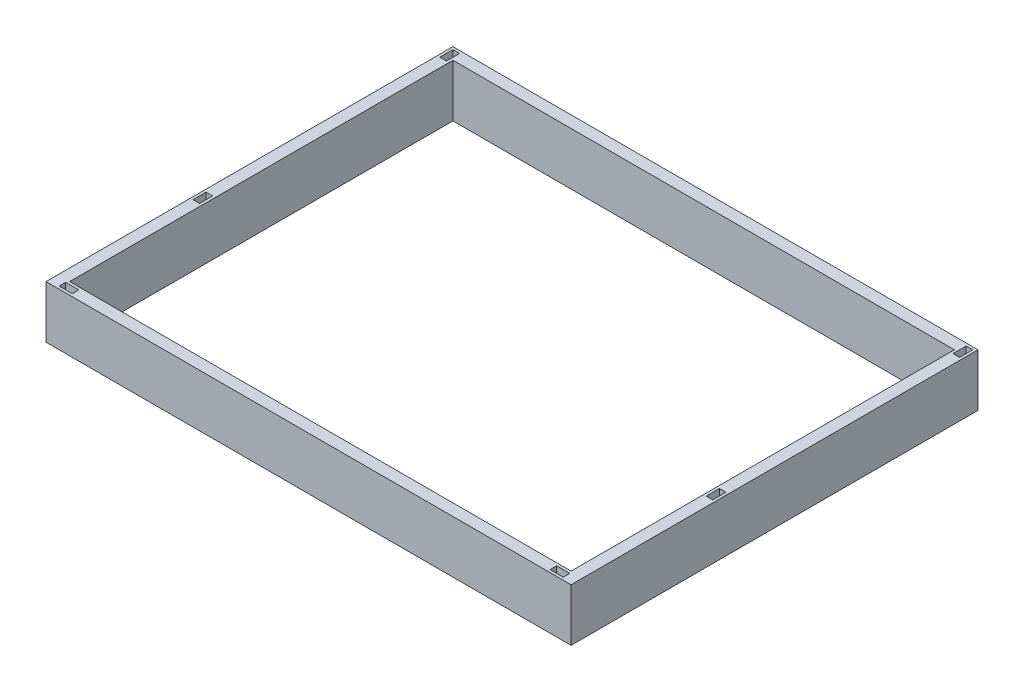
ISO-10303-21;
HEADER;
FILE_DESCRIPTION(('STEP AP214'),'2;1');
FILE_NAME('part.step','',(''),(''),'','','');
FILE_SCHEMA(('AUTOMOTIVE_DESIGN { 1 0 10303 214 1 1 1 1 }'));
ENDSEC;
DATA;
#1=APPLICATION_CONTEXT('core data for automotive mechanical design processes');
#2=APPLICATION_PROTOCOL_DEFINITION('international standard','automotive_design',2000,#1);
#3=PRODUCT_CONTEXT('',#1,'mechanical');
#4=PRODUCT('Part','Part','',(#3));
#5=PRODUCT_RELATED_PRODUCT_CATEGORY('part','',(#4));
#6=PRODUCT_DEFINITION_FORMATION('','',#4);
#7=PRODUCT_DEFINITION_CONTEXT('part definition',#1,'design');
#8=PRODUCT_DEFINITION('design','',#6,#7);
#9=PRODUCT_DEFINITION_SHAPE('','',#8);
#10=(LENGTH_UNIT() NAMED_UNIT(*) SI_UNIT(.MILLI.,.METRE.));
#11=(NAMED_UNIT(*) PLANE_ANGLE_UNIT() SI_UNIT($,.RADIAN.));
#12=(NAMED_UNIT(*) SI_UNIT($,.STERADIAN.) SOLID_ANGLE_UNIT());
#13=UNCERTAINTY_MEASURE_WITH_UNIT(LENGTH_MEASURE(1.E-05),#10,'distance_accuracy_value','');
#14=(GEOMETRIC_REPRESENTATION_CONTEXT(3) GLOBAL_UNCERTAINTY_ASSIGNED_CONTEXT((#13)) GLOBAL_UNIT_ASSIGNED_CONTEXT((#10,
#11,#12)) REPRESENTATION_CONTEXT('',''));
#15=CARTESIAN_POINT('',(0.,0.,0.));
#16=DIRECTION('',(0.,0.,1.));
#17=DIRECTION('',(1.,0.,0.));
#18=AXIS2_PLACEMENT_3D('',#15,#16,#17);
#19=CARTESIAN_POINT('',(0.,20.,17.4999999999998));
#20=DIRECTION('',(0.,0.,-1.));
#21=DIRECTION('',(-1.,0.,0.));
#22=AXIS2_PLACEMENT_3D('',#19,#20,#21);
#23=PLANE('',#22);
#24=DIRECTION('',(1.,0.,0.));
#25=VECTOR('',#24,1.);
#26=CARTESIAN_POINT('',(0.,0.,17.4999999999998));
#27=LINE('',#26,#25);
#28=CARTESIAN_POINT('',(-99.,0.,17.4999999999998));
#29=VERTEX_POINT('',#28);
#30=CARTESIAN_POINT('',(-96.5000000000001,0.,17.4999999999998));
#31=VERTEX_POINT('',#30);
#32=EDGE_CURVE('E405',#29,#31,#27,.T.);
#33=ORIENTED_EDGE('',*,*,#32,.T.);
#34=DIRECTION('',(0.,-1.,0.));
#35=VECTOR('',#34,1.);
#36=CARTESIAN_POINT('',(-96.5000000000001,20.,17.4999999999998));
#37=LINE('',#36,#35);
#38=CARTESIAN_POINT('',(-96.5000000000001,20.,17.4999999999998));
#39=VERTEX_POINT('',#38);
#40=EDGE_CURVE('E11',#39,#31,#37,.T.);
#41=ORIENTED_EDGE('',*,*,#40,.F.);
#42=DIRECTION('',(1.,0.,0.));
#43=VECTOR('',#42,1.);
#44=CARTESIAN_POINT('',(0.,20.,17.4999999999998));
#45=LINE('',#44,#43);
#46=CARTESIAN_POINT('',(-99.,20.,17.4999999999998));
#47=VERTEX_POINT('',#46);
#48=EDGE_CURVE('E273',#47,#39,#45,.T.);
#49=ORIENTED_EDGE('',*,*,#48,.F.);
#50=DIRECTION('',(0.,-1.,0.));
#51=VECTOR('',#50,1.);
#52=CARTESIAN_POINT('',(-99.,20.,17.4999999999998));
#53=LINE('',#52,#51);
#54=EDGE_CURVE('E69',#47,#29,#53,.T.);
#55=ORIENTED_EDGE('',*,*,#54,.T.);
#56=EDGE_LOOP('',(#33,#41,#49,#55));
#57=FACE_BOUND('',#56,.T.);
#58=ADVANCED_FACE('F49',(#57),#23,.F.);
#59=CARTESIAN_POINT('',(-96.5000000000001,20.,2.6784130469081E-13));
#60=DIRECTION('',(1.,0.,0.));
#61=DIRECTION('',(0.,0.,-1.));
#62=AXIS2_PLACEMENT_3D('',#59,#60,#61);
#63=PLANE('',#62);
#64=DIRECTION('',(0.,0.,1.));
#65=VECTOR('',#64,1.);
#66=CARTESIAN_POINT('',(-96.5000000000001,0.,2.6784130469081E-13));
#67=LINE('',#66,#65);
#68=CARTESIAN_POINT('',(-96.5,0.,22.5));
#69=VERTEX_POINT('',#68);
#70=EDGE_CURVE('E280',#31,#69,#67,.T.);
#71=ORIENTED_EDGE('',*,*,#70,.T.);
#72=DIRECTION('',(0.,-1.,0.));
#73=VECTOR('',#72,1.);
#74=CARTESIAN_POINT('',(-96.5,20.,22.5));
#75=LINE('',#74,#73);
#76=CARTESIAN_POINT('',(-96.5,20.,22.5));
#77=VERTEX_POINT('',#76);
#78=EDGE_CURVE('E60',#77,#69,#75,.T.);
#79=ORIENTED_EDGE('',*,*,#78,.F.);
#80=DIRECTION('',(0.,0.,1.));
#81=VECTOR('',#80,1.);
#82=CARTESIAN_POINT('',(-96.5000000000001,20.,2.6784130469081E-13));
#83=LINE('',#82,#81);
#84=EDGE_CURVE('E267',#39,#77,#83,.T.);
#85=ORIENTED_EDGE('',*,*,#84,.F.);
#86=ORIENTED_EDGE('',*,*,#40,.T.);
#87=EDGE_LOOP('',(#71,#79,#85,#86));
#88=FACE_BOUND('',#87,.T.);
#89=ADVANCED_FACE('F279',(#88),#63,.F.);
#90=CARTESIAN_POINT('',(0.,20.,22.5));
#91=DIRECTION('',(0.,0.,-1.));
#92=DIRECTION('',(-1.,0.,0.));
#93=AXIS2_PLACEMENT_3D('',#90,#91,#92);
#94=PLANE('',#93);
#95=DIRECTION('',(1.,0.,0.));
#96=VECTOR('',#95,1.);
#97=CARTESIAN_POINT('',(0.,0.,22.5));
#98=LINE('',#97,#96);
#99=CARTESIAN_POINT('',(-99.,0.,22.5));
#100=VERTEX_POINT('',#99);
#101=EDGE_CURVE('E410',#100,#69,#98,.T.);
#102=ORIENTED_EDGE('',*,*,#101,.F.);
#103=DIRECTION('',(0.,-1.,0.));
#104=VECTOR('',#103,1.);
#105=CARTESIAN_POINT('',(-99.,20.,22.5));
#106=LINE('',#105,#104);
#107=CARTESIAN_POINT('',(-99.,20.,22.5));
#108=VERTEX_POINT('',#107);
#109=EDGE_CURVE('E167',#108,#100,#106,.T.);
#110=ORIENTED_EDGE('',*,*,#109,.F.);
#111=DIRECTION('',(1.,0.,0.));
#112=VECTOR('',#111,1.);
#113=CARTESIAN_POINT('',(0.,20.,22.5));
#114=LINE('',#113,#112);
#115=EDGE_CURVE('E272',#108,#77,#114,.T.);
#116=ORIENTED_EDGE('',*,*,#115,.T.);
#117=ORIENTED_EDGE('',*,*,#78,.T.);
#118=EDGE_LOOP('',(#102,#110,#116,#117));
#119=FACE_BOUND('',#118,.T.);
#120=ADVANCED_FACE('F285',(#119),#94,.T.);
#121=CARTESIAN_POINT('',(0.,20.,76.5));
#122=DIRECTION('',(0.,0.,1.));
#123=DIRECTION('',(1.,0.,0.));
#124=AXIS2_PLACEMENT_3D('',#121,#122,#123);
#125=PLANE('',#124);
#126=DIRECTION('',(-1.,0.,0.));
#127=VECTOR('',#126,1.);
#128=CARTESIAN_POINT('',(0.,0.,76.5));
#129=LINE('',#128,#127);
#130=CARTESIAN_POINT('',(96.,0.,76.5));
#131=VERTEX_POINT('',#130);
#132=CARTESIAN_POINT('',(90.9999999999999,0.,76.5));
#133=VERTEX_POINT('',#132);
#134=EDGE_CURVE('E389',#131,#133,#129,.T.);
#135=ORIENTED_EDGE('',*,*,#134,.T.);
#136=DIRECTION('',(0.,-1.,0.));
#137=VECTOR('',#136,1.);
#138=CARTESIAN_POINT('',(90.9999999999999,20.,76.5));
#139=LINE('',#138,#137);
#140=CARTESIAN_POINT('',(90.9999999999999,20.,76.5));
#141=VERTEX_POINT('',#140);
#142=EDGE_CURVE('E420',#141,#133,#139,.T.);
#143=ORIENTED_EDGE('',*,*,#142,.F.);
#144=DIRECTION('',(-1.,0.,0.));
#145=VECTOR('',#144,1.);
#146=CARTESIAN_POINT('',(0.,20.,76.5));
#147=LINE('',#146,#145);
#148=CARTESIAN_POINT('',(96.,20.,76.5));
#149=VERTEX_POINT('',#148);
#150=EDGE_CURVE('E611',#149,#141,#147,.T.);
#151=ORIENTED_EDGE('',*,*,#150,.F.);
#152=DIRECTION('',(0.,-1.,0.));
#153=VECTOR('',#152,1.);
#154=CARTESIAN_POINT('',(96.,20.,76.5));
#155=LINE('',#154,#153);
#156=EDGE_CURVE('E423',#149,#131,#155,.T.);
#157=ORIENTED_EDGE('',*,*,#156,.T.);
#158=EDGE_LOOP('',(#135,#143,#151,#157));
#159=FACE_BOUND('',#158,.T.);
#160=ADVANCED_FACE('F642',(#159),#125,.F.);
#161=CARTESIAN_POINT('',(90.9999999999999,20.,0.));
#162=DIRECTION('',(-1.,0.,0.));
#163=DIRECTION('',(0.,0.,1.));
#164=AXIS2_PLACEMENT_3D('',#161,#162,#163);
#165=PLANE('',#164);
#166=DIRECTION('',(0.,0.,-1.));
#167=VECTOR('',#166,1.);
#168=CARTESIAN_POINT('',(90.9999999999999,0.,0.));
#169=LINE('',#168,#167);
#170=CARTESIAN_POINT('',(90.9999999999999,0.,74.));
#171=VERTEX_POINT('',#170);
#172=EDGE_CURVE('E393',#133,#171,#169,.T.);
#173=ORIENTED_EDGE('',*,*,#172,.T.);
#174=DIRECTION('',(0.,-1.,0.));
#175=VECTOR('',#174,1.);
#176=CARTESIAN_POINT('',(90.9999999999999,20.,74.));
#177=LINE('',#176,#175);
#178=CARTESIAN_POINT('',(90.9999999999999,20.,74.));
#179=VERTEX_POINT('',#178);
#180=EDGE_CURVE('E430',#179,#171,#177,.T.);
#181=ORIENTED_EDGE('',*,*,#180,.F.);
#182=DIRECTION('',(0.,0.,-1.));
#183=VECTOR('',#182,1.);
#184=CARTESIAN_POINT('',(90.9999999999999,20.,0.));
#185=LINE('',#184,#183);
#186=EDGE_CURVE('E615',#141,#179,#185,.T.);
#187=ORIENTED_EDGE('',*,*,#186,.F.);
#188=ORIENTED_EDGE('',*,*,#142,.T.);
#189=EDGE_LOOP('',(#173,#181,#187,#188));
#190=FACE_BOUND('',#189,.T.);
#191=ADVANCED_FACE('F644',(#190),#165,.F.);
#192=CARTESIAN_POINT('',(0.,20.,74.));
#193=DIRECTION('',(0.,0.,1.));
#194=DIRECTION('',(1.,0.,0.));
#195=AXIS2_PLACEMENT_3D('',#192,#193,#194);
#196=PLANE('',#195);
#197=DIRECTION('',(-1.,0.,0.));
#198=VECTOR('',#197,1.);
#199=CARTESIAN_POINT('',(0.,0.,74.));
#200=LINE('',#199,#198);
#201=CARTESIAN_POINT('',(95.9999999999999,0.,74.));
#202=VERTEX_POINT('',#201);
#203=EDGE_CURVE('E397',#202,#171,#200,.T.);
#204=ORIENTED_EDGE('',*,*,#203,.F.);
#205=DIRECTION('',(0.,-1.,0.));
#206=VECTOR('',#205,1.);
#207=CARTESIAN_POINT('',(95.9999999999999,20.,74.));
#208=LINE('',#207,#206);
#209=CARTESIAN_POINT('',(95.9999999999999,20.,74.));
#210=VERTEX_POINT('',#209);
#211=EDGE_CURVE('E426',#210,#202,#208,.T.);
#212=ORIENTED_EDGE('',*,*,#211,.F.);
#213=DIRECTION('',(-1.,0.,0.));
#214=VECTOR('',#213,1.);
#215=CARTESIAN_POINT('',(0.,20.,74.));
#216=LINE('',#215,#214);
#217=EDGE_CURVE('E618',#210,#179,#216,.T.);
#218=ORIENTED_EDGE('',*,*,#217,.T.);
#219=ORIENTED_EDGE('',*,*,#180,.T.);
#220=EDGE_LOOP('',(#204,#212,#218,#219));
#221=FACE_BOUND('',#220,.T.);
#222=ADVANCED_FACE('F637',(#221),#196,.T.);
#223=CARTESIAN_POINT('',(0.,20.,-77.5));
#224=DIRECTION('',(0.,0.,1.));
#225=DIRECTION('',(1.,0.,0.));
#226=AXIS2_PLACEMENT_3D('',#223,#224,#225);
#227=PLANE('',#226);
#228=DIRECTION('',(-1.,0.,0.));
#229=VECTOR('',#228,1.);
#230=CARTESIAN_POINT('',(0.,0.,-77.5));
#231=LINE('',#230,#229);
#232=CARTESIAN_POINT('',(99.9999999999999,0.,-77.5));
#233=VERTEX_POINT('',#232);
#234=CARTESIAN_POINT('',(-100.,0.,-77.5));
#235=VERTEX_POINT('',#234);
#236=EDGE_CURVE('E373',#233,#235,#231,.T.);
#237=ORIENTED_EDGE('',*,*,#236,.T.);
#238=DIRECTION('',(0.,-1.,0.));
#239=VECTOR('',#238,1.);
#240=CARTESIAN_POINT('',(-100.,20.,-77.5));
#241=LINE('',#240,#239);
#242=CARTESIAN_POINT('',(-100.,20.,-77.5));
#243=VERTEX_POINT('',#242);
#244=EDGE_CURVE('E427',#243,#235,#241,.T.);
#245=ORIENTED_EDGE('',*,*,#244,.F.);
#246=DIRECTION('',(-1.,0.,0.));
#247=VECTOR('',#246,1.);
#248=CARTESIAN_POINT('',(0.,20.,-77.5));
#249=LINE('',#248,#247);
#250=CARTESIAN_POINT('',(99.9999999999999,20.,-77.5));
#251=VERTEX_POINT('',#250);
#252=EDGE_CURVE('E596',#251,#243,#249,.T.);
#253=ORIENTED_EDGE('',*,*,#252,.F.);
#254=DIRECTION('',(0.,-1.,0.));
#255=VECTOR('',#254,1.);
#256=CARTESIAN_POINT('',(99.9999999999999,20.,-77.5));
#257=LINE('',#256,#255);
#258=EDGE_CURVE('E436',#251,#233,#257,.T.);
#259=ORIENTED_EDGE('',*,*,#258,.T.);
#260=EDGE_LOOP('',(#237,#245,#253,#259));
#261=FACE_BOUND('',#260,.T.);
#262=ADVANCED_FACE('F651',(#261),#227,.F.);
#263=CARTESIAN_POINT('',(-100.,20.,0.));
#264=DIRECTION('',(1.,0.,0.));
#265=DIRECTION('',(0.,0.,-1.));
#266=AXIS2_PLACEMENT_3D('',#263,#264,#265);
#267=PLANE('',#266);
#268=DIRECTION('',(0.,0.,1.));
#269=VECTOR('',#268,1.);
#270=CARTESIAN_POINT('',(-100.,0.,0.));
#271=LINE('',#270,#269);
#272=CARTESIAN_POINT('',(-100.,0.,77.5));
#273=VERTEX_POINT('',#272);
#274=EDGE_CURVE('E377',#235,#273,#271,.T.);
#275=ORIENTED_EDGE('',*,*,#274,.T.);
#276=DIRECTION('',(0.,-1.,0.));
#277=VECTOR('',#276,1.);
#278=CARTESIAN_POINT('',(-100.,20.,77.5));
#279=LINE('',#278,#277);
#280=CARTESIAN_POINT('',(-100.,20.,77.5));
#281=VERTEX_POINT('',#280);
#282=EDGE_CURVE('E443',#281,#273,#279,.T.);
#283=ORIENTED_EDGE('',*,*,#282,.F.);
#284=DIRECTION('',(0.,0.,1.));
#285=VECTOR('',#284,1.);
#286=CARTESIAN_POINT('',(-100.,20.,0.));
#287=LINE('',#286,#285);
#288=EDGE_CURVE('E600',#243,#281,#287,.T.);
#289=ORIENTED_EDGE('',*,*,#288,.F.);
#290=ORIENTED_EDGE('',*,*,#244,.T.);
#291=EDGE_LOOP('',(#275,#283,#289,#290));
#292=FACE_BOUND('',#291,.T.);
#293=ADVANCED_FACE('F746',(#292),#267,.F.);
#294=CARTESIAN_POINT('',(0.,20.,77.5));
#295=DIRECTION('',(0.,0.,1.));
#296=DIRECTION('',(1.,0.,0.));
#297=AXIS2_PLACEMENT_3D('',#294,#295,#296);
#298=PLANE('',#297);
#299=DIRECTION('',(-1.,0.,0.));
#300=VECTOR('',#299,1.);
#301=CARTESIAN_POINT('',(0.,0.,77.5));
#302=LINE('',#301,#300);
#303=CARTESIAN_POINT('',(100.,0.,77.5));
#304=VERTEX_POINT('',#303);
#305=EDGE_CURVE('E381',#304,#273,#302,.T.);
#306=ORIENTED_EDGE('',*,*,#305,.F.);
#307=DIRECTION('',(0.,-1.,0.));
#308=VECTOR('',#307,1.);
#309=CARTESIAN_POINT('',(100.,20.,77.5));
#310=LINE('',#309,#308);
#311=CARTESIAN_POINT('',(100.,20.,77.5));
#312=VERTEX_POINT('',#311);
#313=EDGE_CURVE('E439',#312,#304,#310,.T.);
#314=ORIENTED_EDGE('',*,*,#313,.F.);
#315=DIRECTION('',(-1.,0.,0.));
#316=VECTOR('',#315,1.);
#317=CARTESIAN_POINT('',(0.,20.,77.5));
#318=LINE('',#317,#316);
#319=EDGE_CURVE('E603',#312,#281,#318,.T.);
#320=ORIENTED_EDGE('',*,*,#319,.T.);
#321=ORIENTED_EDGE('',*,*,#282,.T.);
#322=EDGE_LOOP('',(#306,#314,#320,#321));
#323=FACE_BOUND('',#322,.T.);
#324=ADVANCED_FACE('F733',(#323),#298,.T.);
#325=CARTESIAN_POINT('',(-95.5,20.,0.));
#326=DIRECTION('',(1.,0.,0.));
#327=DIRECTION('',(0.,0.,-1.));
#328=AXIS2_PLACEMENT_3D('',#325,#326,#327);
#329=PLANE('',#328);
#330=DIRECTION('',(0.,0.,1.));
#331=VECTOR('',#330,1.);
#332=CARTESIAN_POINT('',(-95.5,0.,0.));
#333=LINE('',#332,#331);
#334=CARTESIAN_POINT('',(-95.5,0.,-73.));
#335=VERTEX_POINT('',#334);
#336=CARTESIAN_POINT('',(-95.5,0.,73.));
#337=VERTEX_POINT('',#336);
#338=EDGE_CURVE('E357',#335,#337,#333,.T.);
#339=ORIENTED_EDGE('',*,*,#338,.F.);
#340=DIRECTION('',(0.,-1.,0.));
#341=VECTOR('',#340,1.);
#342=CARTESIAN_POINT('',(-95.5,20.,-73.));
#343=LINE('',#342,#341);
#344=CARTESIAN_POINT('',(-95.5,20.,-73.));
#345=VERTEX_POINT('',#344);
#346=EDGE_CURVE('E440',#345,#335,#343,.T.);
#347=ORIENTED_EDGE('',*,*,#346,.F.);
#348=DIRECTION('',(0.,0.,1.));
#349=VECTOR('',#348,1.);
#350=CARTESIAN_POINT('',(-95.5,20.,0.));
#351=LINE('',#350,#349);
#352=CARTESIAN_POINT('',(-95.5,20.,73.));
#353=VERTEX_POINT('',#352);
#354=EDGE_CURVE('E581',#345,#353,#351,.T.);
#355=ORIENTED_EDGE('',*,*,#354,.T.);
#356=DIRECTION('',(0.,-1.,0.));
#357=VECTOR('',#356,1.);
#358=CARTESIAN_POINT('',(-95.5,20.,73.));
#359=LINE('',#358,#357);
#360=EDGE_CURVE('E449',#353,#337,#359,.T.);
#361=ORIENTED_EDGE('',*,*,#360,.T.);
#362=EDGE_LOOP('',(#339,#347,#355,#361));
#363=FACE_BOUND('',#362,.T.);
#364=ADVANCED_FACE('F729',(#363),#329,.T.);
#365=CARTESIAN_POINT('',(0.,20.,-73.));
#366=DIRECTION('',(0.,0.,1.));
#367=DIRECTION('',(1.,0.,0.));
#368=AXIS2_PLACEMENT_3D('',#365,#366,#367);
#369=PLANE('',#368);
#370=DIRECTION('',(-1.,0.,0.));
#371=VECTOR('',#370,1.);
#372=CARTESIAN_POINT('',(0.,0.,-73.));
#373=LINE('',#372,#371);
#374=CARTESIAN_POINT('',(95.5,0.,-73.));
#375=VERTEX_POINT('',#374);
#376=EDGE_CURVE('E361',#375,#335,#373,.T.);
#377=ORIENTED_EDGE('',*,*,#376,.F.);
#378=DIRECTION('',(0.,-1.,0.));
#379=VECTOR('',#378,1.);
#380=CARTESIAN_POINT('',(95.5,20.,-73.));
#381=LINE('',#380,#379);
#382=CARTESIAN_POINT('',(95.5,20.,-73.));
#383=VERTEX_POINT('',#382);
#384=EDGE_CURVE('E457',#383,#375,#381,.T.);
#385=ORIENTED_EDGE('',*,*,#384,.F.);
#386=DIRECTION('',(-1.,0.,0.));
#387=VECTOR('',#386,1.);
#388=CARTESIAN_POINT('',(0.,20.,-73.));
#389=LINE('',#388,#387);
#390=EDGE_CURVE('E585',#383,#345,#389,.T.);
#391=ORIENTED_EDGE('',*,*,#390,.T.);
#392=ORIENTED_EDGE('',*,*,#346,.T.);
#393=EDGE_LOOP('',(#377,#385,#391,#392));
#394=FACE_BOUND('',#393,.T.);
#395=ADVANCED_FACE('F732',(#394),#369,.T.);
#396=CARTESIAN_POINT('',(95.5,20.,0.));
#397=DIRECTION('',(1.,0.,0.));
#398=DIRECTION('',(0.,0.,-1.));
#399=AXIS2_PLACEMENT_3D('',#396,#397,#398);
#400=PLANE('',#399);
#401=DIRECTION('',(0.,0.,1.));
#402=VECTOR('',#401,1.);
#403=CARTESIAN_POINT('',(95.5,0.,0.));
#404=LINE('',#403,#402);
#405=CARTESIAN_POINT('',(95.5,0.,73.));
#406=VERTEX_POINT('',#405);
#407=EDGE_CURVE('E365',#375,#406,#404,.T.);
#408=ORIENTED_EDGE('',*,*,#407,.T.);
#409=DIRECTION('',(0.,-1.,0.));
#410=VECTOR('',#409,1.);
#411=CARTESIAN_POINT('',(95.5,20.,73.));
#412=LINE('',#411,#410);
#413=CARTESIAN_POINT('',(95.5,20.,73.));
#414=VERTEX_POINT('',#413);
#415=EDGE_CURVE('E452',#414,#406,#412,.T.);
#416=ORIENTED_EDGE('',*,*,#415,.F.);
#417=DIRECTION('',(0.,0.,1.));
#418=VECTOR('',#417,1.);
#419=CARTESIAN_POINT('',(95.5,20.,0.));
#420=LINE('',#419,#418);
#421=EDGE_CURVE('E589',#383,#414,#420,.T.);
#422=ORIENTED_EDGE('',*,*,#421,.F.);
#423=ORIENTED_EDGE('',*,*,#384,.T.);
#424=EDGE_LOOP('',(#408,#416,#422,#423));
#425=FACE_BOUND('',#424,.T.);
#426=ADVANCED_FACE('F718',(#425),#400,.F.);
#427=CARTESIAN_POINT('',(-91.,20.,0.));
#428=DIRECTION('',(-1.,0.,0.));
#429=DIRECTION('',(0.,0.,1.));
#430=AXIS2_PLACEMENT_3D('',#427,#428,#429);
#431=PLANE('',#430);
#432=DIRECTION('',(0.,0.,-1.));
#433=VECTOR('',#432,1.);
#434=CARTESIAN_POINT('',(-91.,0.,0.));
#435=LINE('',#434,#433);
#436=CARTESIAN_POINT('',(-91.,0.,76.5));
#437=VERTEX_POINT('',#436);
#438=CARTESIAN_POINT('',(-91.,0.,74.));
#439=VERTEX_POINT('',#438);
#440=EDGE_CURVE('E341',#437,#439,#435,.T.);
#441=ORIENTED_EDGE('',*,*,#440,.F.);
#442=DIRECTION('',(0.,-1.,0.));
#443=VECTOR('',#442,1.);
#444=CARTESIAN_POINT('',(-91.,20.,76.5));
#445=LINE('',#444,#443);
#446=CARTESIAN_POINT('',(-91.,20.,76.5));
#447=VERTEX_POINT('',#446);
#448=EDGE_CURVE('E453',#447,#437,#445,.T.);
#449=ORIENTED_EDGE('',*,*,#448,.F.);
#450=DIRECTION('',(0.,0.,-1.));
#451=VECTOR('',#450,1.);
#452=CARTESIAN_POINT('',(-91.,20.,0.));
#453=LINE('',#452,#451);
#454=CARTESIAN_POINT('',(-91.,20.,74.));
#455=VERTEX_POINT('',#454);
#456=EDGE_CURVE('E566',#447,#455,#453,.T.);
#457=ORIENTED_EDGE('',*,*,#456,.T.);
#458=DIRECTION('',(0.,-1.,0.));
#459=VECTOR('',#458,1.);
#460=CARTESIAN_POINT('',(-91.,20.,74.));
#461=LINE('',#460,#459);
#462=EDGE_CURVE('E462',#455,#439,#461,.T.);
#463=ORIENTED_EDGE('',*,*,#462,.T.);
#464=EDGE_LOOP('',(#441,#449,#457,#463));
#465=FACE_BOUND('',#464,.T.);
#466=ADVANCED_FACE('F714',(#465),#431,.T.);
#467=CARTESIAN_POINT('',(0.,20.,76.5));
#468=DIRECTION('',(0.,0.,-1.));
#469=DIRECTION('',(-1.,0.,0.));
#470=AXIS2_PLACEMENT_3D('',#467,#468,#469);
#471=PLANE('',#470);
#472=DIRECTION('',(1.,0.,0.));
#473=VECTOR('',#472,1.);
#474=CARTESIAN_POINT('',(0.,0.,76.5));
#475=LINE('',#474,#473);
#476=CARTESIAN_POINT('',(-96.,0.,76.5));
#477=VERTEX_POINT('',#476);
#478=EDGE_CURVE('E345',#477,#437,#475,.T.);
#479=ORIENTED_EDGE('',*,*,#478,.F.);
#480=DIRECTION('',(0.,-1.,0.));
#481=VECTOR('',#480,1.);
#482=CARTESIAN_POINT('',(-96.,20.,76.5));
#483=LINE('',#482,#481);
#484=CARTESIAN_POINT('',(-96.,20.,76.5));
#485=VERTEX_POINT('',#484);
#486=EDGE_CURVE('E470',#485,#477,#483,.T.);
#487=ORIENTED_EDGE('',*,*,#486,.F.);
#488=DIRECTION('',(1.,0.,0.));
#489=VECTOR('',#488,1.);
#490=CARTESIAN_POINT('',(0.,20.,76.5));
#491=LINE('',#490,#489);
#492=EDGE_CURVE('E570',#485,#447,#491,.T.);
#493=ORIENTED_EDGE('',*,*,#492,.T.);
#494=ORIENTED_EDGE('',*,*,#448,.T.);
#495=EDGE_LOOP('',(#479,#487,#493,#494));
#496=FACE_BOUND('',#495,.T.);
#497=ADVANCED_FACE('F717',(#496),#471,.T.);
#498=CARTESIAN_POINT('',(-96.,20.,0.));
#499=DIRECTION('',(-1.,0.,0.));
#500=DIRECTION('',(0.,0.,1.));
#501=AXIS2_PLACEMENT_3D('',#498,#499,#500);
#502=PLANE('',#501);
#503=DIRECTION('',(0.,0.,-1.));
#504=VECTOR('',#503,1.);
#505=CARTESIAN_POINT('',(-96.,0.,0.));
#506=LINE('',#505,#504);
#507=CARTESIAN_POINT('',(-96.,0.,74.));
#508=VERTEX_POINT('',#507);
#509=EDGE_CURVE('E349',#477,#508,#506,.T.);
#510=ORIENTED_EDGE('',*,*,#509,.T.);
#511=DIRECTION('',(0.,-1.,0.));
#512=VECTOR('',#511,1.);
#513=CARTESIAN_POINT('',(-96.,20.,74.));
#514=LINE('',#513,#512);
#515=CARTESIAN_POINT('',(-96.,20.,74.));
#516=VERTEX_POINT('',#515);
#517=EDGE_CURVE('E465',#516,#508,#514,.T.);
#518=ORIENTED_EDGE('',*,*,#517,.F.);
#519=DIRECTION('',(0.,0.,-1.));
#520=VECTOR('',#519,1.);
#521=CARTESIAN_POINT('',(-96.,20.,0.));
#522=LINE('',#521,#520);
#523=EDGE_CURVE('E574',#485,#516,#522,.T.);
#524=ORIENTED_EDGE('',*,*,#523,.F.);
#525=ORIENTED_EDGE('',*,*,#486,.T.);
#526=EDGE_LOOP('',(#510,#518,#524,#525));
#527=FACE_BOUND('',#526,.T.);
#528=ADVANCED_FACE('F702',(#527),#502,.F.);
#529=CARTESIAN_POINT('',(96.4999999999999,20.,0.));
#530=DIRECTION('',(1.,0.,0.));
#531=DIRECTION('',(0.,0.,-1.));
#532=AXIS2_PLACEMENT_3D('',#529,#530,#531);
#533=PLANE('',#532);
#534=DIRECTION('',(0.,0.,1.));
#535=VECTOR('',#534,1.);
#536=CARTESIAN_POINT('',(96.4999999999999,0.,0.));
#537=LINE('',#536,#535);
#538=CARTESIAN_POINT('',(96.4999999999999,0.,17.5));
#539=VERTEX_POINT('',#538);
#540=CARTESIAN_POINT('',(96.4999999999999,0.,22.5));
#541=VERTEX_POINT('',#540);
#542=EDGE_CURVE('E325',#539,#541,#537,.T.);
#543=ORIENTED_EDGE('',*,*,#542,.F.);
#544=DIRECTION('',(0.,-1.,0.));
#545=VECTOR('',#544,1.);
#546=CARTESIAN_POINT('',(96.4999999999999,20.,17.5));
#547=LINE('',#546,#545);
#548=CARTESIAN_POINT('',(96.4999999999999,20.,17.5));
#549=VERTEX_POINT('',#548);
#550=EDGE_CURVE('E466',#549,#539,#547,.T.);
#551=ORIENTED_EDGE('',*,*,#550,.F.);
#552=DIRECTION('',(0.,0.,1.));
#553=VECTOR('',#552,1.);
#554=CARTESIAN_POINT('',(96.4999999999999,20.,0.));
#555=LINE('',#554,#553);
#556=CARTESIAN_POINT('',(96.4999999999999,20.,22.5));
#557=VERTEX_POINT('',#556);
#558=EDGE_CURVE('E551',#549,#557,#555,.T.);
#559=ORIENTED_EDGE('',*,*,#558,.T.);
#560=DIRECTION('',(0.,-1.,0.));
#561=VECTOR('',#560,1.);
#562=CARTESIAN_POINT('',(96.4999999999999,20.,22.5));
#563=LINE('',#562,#561);
#564=EDGE_CURVE('E475',#557,#541,#563,.T.);
#565=ORIENTED_EDGE('',*,*,#564,.T.);
#566=EDGE_LOOP('',(#543,#551,#559,#565));
#567=FACE_BOUND('',#566,.T.);
#568=ADVANCED_FACE('F698',(#567),#533,.T.);
#569=CARTESIAN_POINT('',(0.,20.,17.5));
#570=DIRECTION('',(0.,0.,1.));
#571=DIRECTION('',(1.,0.,0.));
#572=AXIS2_PLACEMENT_3D('',#569,#570,#571);
#573=PLANE('',#572);
#574=DIRECTION('',(-1.,0.,0.));
#575=VECTOR('',#574,1.);
#576=CARTESIAN_POINT('',(0.,0.,17.5));
#577=LINE('',#576,#575);
#578=CARTESIAN_POINT('',(98.9999999999999,0.,17.5));
#579=VERTEX_POINT('',#578);
#580=EDGE_CURVE('E329',#579,#539,#577,.T.);
#581=ORIENTED_EDGE('',*,*,#580,.F.);
#582=DIRECTION('',(0.,-1.,0.));
#583=VECTOR('',#582,1.);
#584=CARTESIAN_POINT('',(98.9999999999999,20.,17.5));
#585=LINE('',#584,#583);
#586=CARTESIAN_POINT('',(98.9999999999999,20.,17.5));
#587=VERTEX_POINT('',#586);
#588=EDGE_CURVE('E483',#587,#579,#585,.T.);
#589=ORIENTED_EDGE('',*,*,#588,.F.);
#590=DIRECTION('',(-1.,0.,0.));
#591=VECTOR('',#590,1.);
#592=CARTESIAN_POINT('',(0.,20.,17.5));
#593=LINE('',#592,#591);
#594=EDGE_CURVE('E555',#587,#549,#593,.T.);
#595=ORIENTED_EDGE('',*,*,#594,.T.);
#596=ORIENTED_EDGE('',*,*,#550,.T.);
#597=EDGE_LOOP('',(#581,#589,#595,#596));
#598=FACE_BOUND('',#597,.T.);
#599=ADVANCED_FACE('F701',(#598),#573,.T.);
#600=CARTESIAN_POINT('',(98.9999999999998,20.,-8.24340595784177E-13));
#601=DIRECTION('',(1.,0.,0.));
#602=DIRECTION('',(0.,0.,-1.));
#603=AXIS2_PLACEMENT_3D('',#600,#601,#602);
#604=PLANE('',#603);
#605=DIRECTION('',(0.,0.,1.));
#606=VECTOR('',#605,1.);
#607=CARTESIAN_POINT('',(98.9999999999998,0.,-8.24340595784177E-13));
#608=LINE('',#607,#606);
#609=CARTESIAN_POINT('',(99.,0.,22.5));
#610=VERTEX_POINT('',#609);
#611=EDGE_CURVE('E333',#579,#610,#608,.T.);
#612=ORIENTED_EDGE('',*,*,#611,.T.);
#613=DIRECTION('',(0.,-1.,0.));
#614=VECTOR('',#613,1.);
#615=CARTESIAN_POINT('',(99.,20.,22.5));
#616=LINE('',#615,#614);
#617=CARTESIAN_POINT('',(99.,20.,22.5));
#618=VERTEX_POINT('',#617);
#619=EDGE_CURVE('E478',#618,#610,#616,.T.);
#620=ORIENTED_EDGE('',*,*,#619,.F.);
#621=DIRECTION('',(0.,0.,1.));
#622=VECTOR('',#621,1.);
#623=CARTESIAN_POINT('',(98.9999999999998,20.,-8.24340595784177E-13));
#624=LINE('',#623,#622);
#625=EDGE_CURVE('E559',#587,#618,#624,.T.);
#626=ORIENTED_EDGE('',*,*,#625,.F.);
#627=ORIENTED_EDGE('',*,*,#588,.T.);
#628=EDGE_LOOP('',(#612,#620,#626,#627));
#629=FACE_BOUND('',#628,.T.);
#630=ADVANCED_FACE('F685',(#629),#604,.F.);
#631=CARTESIAN_POINT('',(96.5,20.,0.));
#632=DIRECTION('',(1.,0.,0.));
#633=DIRECTION('',(0.,0.,-1.));
#634=AXIS2_PLACEMENT_3D('',#631,#632,#633);
#635=PLANE('',#634);
#636=DIRECTION('',(0.,0.,1.));
#637=VECTOR('',#636,1.);
#638=CARTESIAN_POINT('',(96.5,0.,0.));
#639=LINE('',#638,#637);
#640=CARTESIAN_POINT('',(96.5,0.,-76.5));
#641=VERTEX_POINT('',#640);
#642=CARTESIAN_POINT('',(96.5,0.,-71.5));
#643=VERTEX_POINT('',#642);
#644=EDGE_CURVE('E309',#641,#643,#639,.T.);
#645=ORIENTED_EDGE('',*,*,#644,.F.);
#646=DIRECTION('',(0.,-1.,0.));
#647=VECTOR('',#646,1.);
#648=CARTESIAN_POINT('',(96.5,20.,-76.5));
#649=LINE('',#648,#647);
#650=CARTESIAN_POINT('',(96.5,20.,-76.5));
#651=VERTEX_POINT('',#650);
#652=EDGE_CURVE('E479',#651,#641,#649,.T.);
#653=ORIENTED_EDGE('',*,*,#652,.F.);
#654=DIRECTION('',(0.,0.,1.));
#655=VECTOR('',#654,1.);
#656=CARTESIAN_POINT('',(96.5,20.,0.));
#657=LINE('',#656,#655);
#658=CARTESIAN_POINT('',(96.5,20.,-71.5));
#659=VERTEX_POINT('',#658);
#660=EDGE_CURVE('E530',#651,#659,#657,.T.);
#661=ORIENTED_EDGE('',*,*,#660,.T.);
#662=DIRECTION('',(0.,-1.,0.));
#663=VECTOR('',#662,1.);
#664=CARTESIAN_POINT('',(96.5,20.,-71.5));
#665=LINE('',#664,#663);
#666=EDGE_CURVE('E488',#659,#643,#665,.T.);
#667=ORIENTED_EDGE('',*,*,#666,.T.);
#668=EDGE_LOOP('',(#645,#653,#661,#667));
#669=FACE_BOUND('',#668,.T.);
#670=ADVANCED_FACE('F681',(#669),#635,.T.);
#671=CARTESIAN_POINT('',(-8.49320613838237E-13,20.,-76.4999999999989));
#672=DIRECTION('',(0.,0.,1.));
#673=DIRECTION('',(1.,0.,0.));
#674=AXIS2_PLACEMENT_3D('',#671,#672,#673);
#675=PLANE('',#674);
#676=DIRECTION('',(-1.,0.,0.));
#677=VECTOR('',#676,1.);
#678=CARTESIAN_POINT('',(-8.49320613838237E-13,0.,-76.4999999999989));
#679=LINE('',#678,#677);
#680=CARTESIAN_POINT('',(99.,0.,-76.5));
#681=VERTEX_POINT('',#680);
#682=EDGE_CURVE('E313',#681,#641,#679,.T.);
#683=ORIENTED_EDGE('',*,*,#682,.F.);
#684=DIRECTION('',(0.,-1.,0.));
#685=VECTOR('',#684,1.);
#686=CARTESIAN_POINT('',(99.,20.,-76.5));
#687=LINE('',#686,#685);
#688=CARTESIAN_POINT('',(99.,20.,-76.5));
#689=VERTEX_POINT('',#688);
#690=EDGE_CURVE('E495',#689,#681,#687,.T.);
#691=ORIENTED_EDGE('',*,*,#690,.F.);
#692=DIRECTION('',(-1.,0.,0.));
#693=VECTOR('',#692,1.);
#694=CARTESIAN_POINT('',(-8.49320613838237E-13,20.,-76.4999999999989));
#695=LINE('',#694,#693);
#696=EDGE_CURVE('E536',#689,#651,#695,.T.);
#697=ORIENTED_EDGE('',*,*,#696,.T.);
#698=ORIENTED_EDGE('',*,*,#652,.T.);
#699=EDGE_LOOP('',(#683,#691,#697,#698));
#700=FACE_BOUND('',#699,.T.);
#701=ADVANCED_FACE('F684',(#700),#675,.T.);
#702=CARTESIAN_POINT('',(99.,20.,0.));
#703=DIRECTION('',(1.,0.,0.));
#704=DIRECTION('',(0.,0.,-1.));
#705=AXIS2_PLACEMENT_3D('',#702,#703,#704);
#706=PLANE('',#705);
#707=DIRECTION('',(0.,0.,1.));
#708=VECTOR('',#707,1.);
#709=CARTESIAN_POINT('',(99.,0.,0.));
#710=LINE('',#709,#708);
#711=CARTESIAN_POINT('',(99.,0.,-71.5));
#712=VERTEX_POINT('',#711);
#713=EDGE_CURVE('E317',#681,#712,#710,.T.);
#714=ORIENTED_EDGE('',*,*,#713,.T.);
#715=DIRECTION('',(0.,-1.,0.));
#716=VECTOR('',#715,1.);
#717=CARTESIAN_POINT('',(99.,20.,-71.5));
#718=LINE('',#717,#716);
#719=CARTESIAN_POINT('',(99.,20.,-71.5));
#720=VERTEX_POINT('',#719);
#721=EDGE_CURVE('E491',#720,#712,#718,.T.);
#722=ORIENTED_EDGE('',*,*,#721,.F.);
#723=DIRECTION('',(0.,0.,1.));
#724=VECTOR('',#723,1.);
#725=CARTESIAN_POINT('',(99.,20.,0.));
#726=LINE('',#725,#724);
#727=EDGE_CURVE('E544',#689,#720,#726,.T.);
#728=ORIENTED_EDGE('',*,*,#727,.F.);
#729=ORIENTED_EDGE('',*,*,#690,.T.);
#730=EDGE_LOOP('',(#714,#722,#728,#729));
#731=FACE_BOUND('',#730,.T.);
#732=ADVANCED_FACE('F689',(#731),#706,.F.);
#733=CARTESIAN_POINT('',(-96.5,20.,0.));
#734=DIRECTION('',(-1.,0.,0.));
#735=DIRECTION('',(0.,0.,1.));
#736=AXIS2_PLACEMENT_3D('',#733,#734,#735);
#737=PLANE('',#736);
#738=DIRECTION('',(0.,0.,-1.));
#739=VECTOR('',#738,1.);
#740=CARTESIAN_POINT('',(-96.5,0.,0.));
#741=LINE('',#740,#739);
#742=CARTESIAN_POINT('',(-96.5,0.,-71.5));
#743=VERTEX_POINT('',#742);
#744=CARTESIAN_POINT('',(-96.5,0.,-76.5));
#745=VERTEX_POINT('',#744);
#746=EDGE_CURVE('E294',#743,#745,#741,.T.);
#747=ORIENTED_EDGE('',*,*,#746,.F.);
#748=DIRECTION('',(0.,-1.,0.));
#749=VECTOR('',#748,1.);
#750=CARTESIAN_POINT('',(-96.5,20.,-71.5));
#751=LINE('',#750,#749);
#752=CARTESIAN_POINT('',(-96.5,20.,-71.5));
#753=VERTEX_POINT('',#752);
#754=EDGE_CURVE('E53',#753,#743,#751,.T.);
#755=ORIENTED_EDGE('',*,*,#754,.F.);
#756=DIRECTION('',(0.,0.,-1.));
#757=VECTOR('',#756,1.);
#758=CARTESIAN_POINT('',(-96.5,20.,0.));
#759=LINE('',#758,#757);
#760=CARTESIAN_POINT('',(-96.5,20.,-76.5));
#761=VERTEX_POINT('',#760);
#762=EDGE_CURVE('E417',#753,#761,#759,.T.);
#763=ORIENTED_EDGE('',*,*,#762,.T.);
#764=DIRECTION('',(0.,-1.,0.));
#765=VECTOR('',#764,1.);
#766=CARTESIAN_POINT('',(-96.5,20.,-76.5));
#767=LINE('',#766,#765);
#768=EDGE_CURVE('E290',#761,#745,#767,.T.);
#769=ORIENTED_EDGE('',*,*,#768,.T.);
#770=EDGE_LOOP('',(#747,#755,#763,#769));
#771=FACE_BOUND('',#770,.T.);
#772=ADVANCED_FACE('F51',(#771),#737,.T.);
#773=CARTESIAN_POINT('',(0.,20.,-71.5));
#774=DIRECTION('',(0.,0.,-1.));
#775=DIRECTION('',(-1.,0.,0.));
#776=AXIS2_PLACEMENT_3D('',#773,#774,#775);
#777=PLANE('',#776);
#778=DIRECTION('',(1.,0.,0.));
#779=VECTOR('',#778,1.);
#780=CARTESIAN_POINT('',(0.,0.,-71.5));
#781=LINE('',#780,#779);
#782=CARTESIAN_POINT('',(-99.,0.,-71.5));
#783=VERTEX_POINT('',#782);
#784=EDGE_CURVE('E298',#783,#743,#781,.T.);
#785=ORIENTED_EDGE('',*,*,#784,.F.);
#786=DIRECTION('',(0.,-1.,0.));
#787=VECTOR('',#786,1.);
#788=CARTESIAN_POINT('',(-99.,20.,-71.5));
#789=LINE('',#788,#787);
#790=CARTESIAN_POINT('',(-99.,20.,-71.5));
#791=VERTEX_POINT('',#790);
#792=EDGE_CURVE('E505',#791,#783,#789,.T.);
#793=ORIENTED_EDGE('',*,*,#792,.F.);
#794=DIRECTION('',(1.,0.,0.));
#795=VECTOR('',#794,1.);
#796=CARTESIAN_POINT('',(0.,20.,-71.5));
#797=LINE('',#796,#795);
#798=EDGE_CURVE('E516',#791,#753,#797,.T.);
#799=ORIENTED_EDGE('',*,*,#798,.T.);
#800=ORIENTED_EDGE('',*,*,#754,.T.);
#801=EDGE_LOOP('',(#785,#793,#799,#800));
#802=FACE_BOUND('',#801,.T.);
#803=ADVANCED_FACE('F514',(#802),#777,.T.);
#804=CARTESIAN_POINT('',(-99.,20.,0.));
#805=DIRECTION('',(-1.,0.,0.));
#806=DIRECTION('',(0.,0.,1.));
#807=AXIS2_PLACEMENT_3D('',#804,#805,#806);
#808=PLANE('',#807);
#809=DIRECTION('',(0.,0.,-1.));
#810=VECTOR('',#809,1.);
#811=CARTESIAN_POINT('',(-99.,0.,0.));
#812=LINE('',#811,#810);
#813=CARTESIAN_POINT('',(-99.,0.,-76.5));
#814=VERTEX_POINT('',#813);
#815=EDGE_CURVE('E302',#783,#814,#812,.T.);
#816=ORIENTED_EDGE('',*,*,#815,.T.);
#817=DIRECTION('',(0.,-1.,0.));
#818=VECTOR('',#817,1.);
#819=CARTESIAN_POINT('',(-99.,20.,-76.5));
#820=LINE('',#819,#818);
#821=CARTESIAN_POINT('',(-99.,20.,-76.5));
#822=VERTEX_POINT('',#821);
#823=EDGE_CURVE('E502',#822,#814,#820,.T.);
#824=ORIENTED_EDGE('',*,*,#823,.F.);
#825=DIRECTION('',(0.,0.,-1.));
#826=VECTOR('',#825,1.);
#827=CARTESIAN_POINT('',(-99.,20.,0.));
#828=LINE('',#827,#826);
#829=EDGE_CURVE('E531',#791,#822,#828,.T.);
#830=ORIENTED_EDGE('',*,*,#829,.F.);
#831=ORIENTED_EDGE('',*,*,#792,.T.);
#832=EDGE_LOOP('',(#816,#824,#830,#831));
#833=FACE_BOUND('',#832,.T.);
#834=ADVANCED_FACE('F523',(#833),#808,.F.);
#835=CARTESIAN_POINT('',(95.9999999999995,20.,-5.32907051820072E-13));
#836=DIRECTION('',(-1.,0.,0.));
#837=DIRECTION('',(0.,0.,1.));
#838=AXIS2_PLACEMENT_3D('',#835,#836,#837);
#839=PLANE('',#838);
#840=DIRECTION('',(0.,0.,-1.));
#841=VECTOR('',#840,1.);
#842=CARTESIAN_POINT('',(95.9999999999995,0.,-5.32907051820072E-13));
#843=LINE('',#842,#841);
#844=EDGE_CURVE('E401',#131,#202,#843,.T.);
#845=ORIENTED_EDGE('',*,*,#844,.F.);
#846=ORIENTED_EDGE('',*,*,#156,.F.);
#847=DIRECTION('',(0.,0.,-1.));
#848=VECTOR('',#847,1.);
#849=CARTESIAN_POINT('',(95.9999999999995,20.,-5.32907051820072E-13));
#850=LINE('',#849,#848);
#851=EDGE_CURVE('E622',#149,#210,#850,.T.);
#852=ORIENTED_EDGE('',*,*,#851,.T.);
#853=ORIENTED_EDGE('',*,*,#211,.T.);
#854=EDGE_LOOP('',(#845,#846,#852,#853));
#855=FACE_BOUND('',#854,.T.);
#856=ADVANCED_FACE('F629',(#855),#839,.T.);
#857=CARTESIAN_POINT('',(99.9999999999999,20.,0.));
#858=DIRECTION('',(1.,0.,0.));
#859=DIRECTION('',(0.,0.,-1.));
#860=AXIS2_PLACEMENT_3D('',#857,#858,#859);
#861=PLANE('',#860);
#862=DIRECTION('',(0.,0.,1.));
#863=VECTOR('',#862,1.);
#864=CARTESIAN_POINT('',(99.9999999999999,0.,0.));
#865=LINE('',#864,#863);
#866=EDGE_CURVE('E385',#233,#304,#865,.T.);
#867=ORIENTED_EDGE('',*,*,#866,.F.);
#868=ORIENTED_EDGE('',*,*,#258,.F.);
#869=DIRECTION('',(0.,0.,1.));
#870=VECTOR('',#869,1.);
#871=CARTESIAN_POINT('',(99.9999999999999,20.,0.));
#872=LINE('',#871,#870);
#873=EDGE_CURVE('E607',#251,#312,#872,.T.);
#874=ORIENTED_EDGE('',*,*,#873,.T.);
#875=ORIENTED_EDGE('',*,*,#313,.T.);
#876=EDGE_LOOP('',(#867,#868,#874,#875));
#877=FACE_BOUND('',#876,.T.);
#878=ADVANCED_FACE('F663',(#877),#861,.T.);
#879=CARTESIAN_POINT('',(0.,20.,73.));
#880=DIRECTION('',(0.,0.,1.));
#881=DIRECTION('',(1.,0.,0.));
#882=AXIS2_PLACEMENT_3D('',#879,#880,#881);
#883=PLANE('',#882);
#884=DIRECTION('',(-1.,0.,0.));
#885=VECTOR('',#884,1.);
#886=CARTESIAN_POINT('',(0.,0.,73.));
#887=LINE('',#886,#885);
#888=EDGE_CURVE('E369',#406,#337,#887,.T.);
#889=ORIENTED_EDGE('',*,*,#888,.T.);
#890=ORIENTED_EDGE('',*,*,#360,.F.);
#891=DIRECTION('',(-1.,0.,0.));
#892=VECTOR('',#891,1.);
#893=CARTESIAN_POINT('',(0.,20.,73.));
#894=LINE('',#893,#892);
#895=EDGE_CURVE('E593',#414,#353,#894,.T.);
#896=ORIENTED_EDGE('',*,*,#895,.F.);
#897=ORIENTED_EDGE('',*,*,#415,.T.);
#898=EDGE_LOOP('',(#889,#890,#896,#897));
#899=FACE_BOUND('',#898,.T.);
#900=ADVANCED_FACE('F669',(#899),#883,.F.);
#901=CARTESIAN_POINT('',(0.,20.,74.));
#902=DIRECTION('',(0.,0.,-1.));
#903=DIRECTION('',(-1.,0.,0.));
#904=AXIS2_PLACEMENT_3D('',#901,#902,#903);
#905=PLANE('',#904);
#906=DIRECTION('',(1.,0.,0.));
#907=VECTOR('',#906,1.);
#908=CARTESIAN_POINT('',(0.,0.,74.));
#909=LINE('',#908,#907);
#910=EDGE_CURVE('E353',#508,#439,#909,.T.);
#911=ORIENTED_EDGE('',*,*,#910,.T.);
#912=ORIENTED_EDGE('',*,*,#462,.F.);
#913=DIRECTION('',(1.,0.,0.));
#914=VECTOR('',#913,1.);
#915=CARTESIAN_POINT('',(0.,20.,74.));
#916=LINE('',#915,#914);
#917=EDGE_CURVE('E578',#516,#455,#916,.T.);
#918=ORIENTED_EDGE('',*,*,#917,.F.);
#919=ORIENTED_EDGE('',*,*,#517,.T.);
#920=EDGE_LOOP('',(#911,#912,#918,#919));
#921=FACE_BOUND('',#920,.T.);
#922=ADVANCED_FACE('F712',(#921),#905,.F.);
#923=CARTESIAN_POINT('',(0.,20.,22.5));
#924=DIRECTION('',(0.,0.,1.));
#925=DIRECTION('',(1.,0.,0.));
#926=AXIS2_PLACEMENT_3D('',#923,#924,#925);
#927=PLANE('',#926);
#928=DIRECTION('',(-1.,0.,0.));
#929=VECTOR('',#928,1.);
#930=CARTESIAN_POINT('',(0.,0.,22.5));
#931=LINE('',#930,#929);
#932=EDGE_CURVE('E337',#610,#541,#931,.T.);
#933=ORIENTED_EDGE('',*,*,#932,.T.);
#934=ORIENTED_EDGE('',*,*,#564,.F.);
#935=DIRECTION('',(-1.,0.,0.));
#936=VECTOR('',#935,1.);
#937=CARTESIAN_POINT('',(0.,20.,22.5));
#938=LINE('',#937,#936);
#939=EDGE_CURVE('E563',#618,#557,#938,.T.);
#940=ORIENTED_EDGE('',*,*,#939,.F.);
#941=ORIENTED_EDGE('',*,*,#619,.T.);
#942=EDGE_LOOP('',(#933,#934,#940,#941));
#943=FACE_BOUND('',#942,.T.);
#944=ADVANCED_FACE('F696',(#943),#927,.F.);
#945=CARTESIAN_POINT('',(0.,20.,-71.5));
#946=DIRECTION('',(0.,0.,1.));
#947=DIRECTION('',(1.,0.,0.));
#948=AXIS2_PLACEMENT_3D('',#945,#946,#947);
#949=PLANE('',#948);
#950=DIRECTION('',(-1.,0.,0.));
#951=VECTOR('',#950,1.);
#952=CARTESIAN_POINT('',(0.,0.,-71.5));
#953=LINE('',#952,#951);
#954=EDGE_CURVE('E321',#712,#643,#953,.T.);
#955=ORIENTED_EDGE('',*,*,#954,.T.);
#956=ORIENTED_EDGE('',*,*,#666,.F.);
#957=DIRECTION('',(-1.,0.,0.));
#958=VECTOR('',#957,1.);
#959=CARTESIAN_POINT('',(0.,20.,-71.5));
#960=LINE('',#959,#958);
#961=EDGE_CURVE('E548',#720,#659,#960,.T.);
#962=ORIENTED_EDGE('',*,*,#961,.F.);
#963=ORIENTED_EDGE('',*,*,#721,.T.);
#964=EDGE_LOOP('',(#955,#956,#962,#963));
#965=FACE_BOUND('',#964,.T.);
#966=ADVANCED_FACE('F680',(#965),#949,.F.);
#967=CARTESIAN_POINT('',(4.24660306919119E-13,20.,-76.4999999999994));
#968=DIRECTION('',(0.,0.,-1.));
#969=DIRECTION('',(-1.,0.,0.));
#970=AXIS2_PLACEMENT_3D('',#967,#968,#969);
#971=PLANE('',#970);
#972=DIRECTION('',(1.,0.,0.));
#973=VECTOR('',#972,1.);
#974=CARTESIAN_POINT('',(4.24660306919119E-13,0.,-76.4999999999994));
#975=LINE('',#974,#973);
#976=EDGE_CURVE('E305',#814,#745,#975,.T.);
#977=ORIENTED_EDGE('',*,*,#976,.T.);
#978=ORIENTED_EDGE('',*,*,#768,.F.);
#979=DIRECTION('',(1.,0.,0.));
#980=VECTOR('',#979,1.);
#981=CARTESIAN_POINT('',(4.24660306919119E-13,20.,-76.4999999999994));
#982=LINE('',#981,#980);
#983=EDGE_CURVE('E527',#822,#761,#982,.T.);
#984=ORIENTED_EDGE('',*,*,#983,.F.);
#985=ORIENTED_EDGE('',*,*,#823,.T.);
#986=EDGE_LOOP('',(#977,#978,#984,#985));
#987=FACE_BOUND('',#986,.T.);
#988=ADVANCED_FACE('F526',(#987),#971,.F.);
#989=CARTESIAN_POINT('',(-99.,20.,0.));
#990=DIRECTION('',(1.,0.,0.));
#991=DIRECTION('',(0.,0.,-1.));
#992=AXIS2_PLACEMENT_3D('',#989,#990,#991);
#993=PLANE('',#992);
#994=DIRECTION('',(0.,0.,1.));
#995=VECTOR('',#994,1.);
#996=CARTESIAN_POINT('',(-99.,0.,0.));
#997=LINE('',#996,#995);
#998=EDGE_CURVE('E413',#29,#100,#997,.T.);
#999=ORIENTED_EDGE('',*,*,#998,.F.);
#1000=ORIENTED_EDGE('',*,*,#54,.F.);
#1001=DIRECTION('',(0.,0.,1.));
#1002=VECTOR('',#1001,1.);
#1003=CARTESIAN_POINT('',(-99.,20.,0.));
#1004=LINE('',#1003,#1002);
#1005=EDGE_CURVE('E287',#47,#108,#1004,.T.);
#1006=ORIENTED_EDGE('',*,*,#1005,.T.);
#1007=ORIENTED_EDGE('',*,*,#109,.T.);
#1008=EDGE_LOOP('',(#999,#1000,#1006,#1007));
#1009=FACE_BOUND('',#1008,.T.);
#1010=ADVANCED_FACE('F679',(#1009),#993,.T.);
#1011=CARTESIAN_POINT('',(0.,20.,0.));
#1012=DIRECTION('',(0.,1.,0.));
#1013=DIRECTION('',(0.,0.,1.));
#1014=AXIS2_PLACEMENT_3D('',#1011,#1012,#1013);
#1015=PLANE('',#1014);
#1016=ORIENTED_EDGE('',*,*,#762,.F.);
#1017=ORIENTED_EDGE('',*,*,#798,.F.);
#1018=ORIENTED_EDGE('',*,*,#829,.T.);
#1019=ORIENTED_EDGE('',*,*,#983,.T.);
#1020=EDGE_LOOP('',(#1016,#1017,#1018,#1019));
#1021=FACE_BOUND('',#1020,.T.);
#1022=ORIENTED_EDGE('',*,*,#660,.F.);
#1023=ORIENTED_EDGE('',*,*,#696,.F.);
#1024=ORIENTED_EDGE('',*,*,#727,.T.);
#1025=ORIENTED_EDGE('',*,*,#961,.T.);
#1026=EDGE_LOOP('',(#1022,#1023,#1024,#1025));
#1027=FACE_BOUND('',#1026,.T.);
#1028=ORIENTED_EDGE('',*,*,#558,.F.);
#1029=ORIENTED_EDGE('',*,*,#594,.F.);
#1030=ORIENTED_EDGE('',*,*,#625,.T.);
#1031=ORIENTED_EDGE('',*,*,#939,.T.);
#1032=EDGE_LOOP('',(#1028,#1029,#1030,#1031));
#1033=FACE_BOUND('',#1032,.T.);
#1034=ORIENTED_EDGE('',*,*,#456,.F.);
#1035=ORIENTED_EDGE('',*,*,#492,.F.);
#1036=ORIENTED_EDGE('',*,*,#523,.T.);
#1037=ORIENTED_EDGE('',*,*,#917,.T.);
#1038=EDGE_LOOP('',(#1034,#1035,#1036,#1037));
#1039=FACE_BOUND('',#1038,.T.);
#1040=ORIENTED_EDGE('',*,*,#354,.F.);
#1041=ORIENTED_EDGE('',*,*,#390,.F.);
#1042=ORIENTED_EDGE('',*,*,#421,.T.);
#1043=ORIENTED_EDGE('',*,*,#895,.T.);
#1044=EDGE_LOOP('',(#1040,#1041,#1042,#1043));
#1045=FACE_BOUND('',#1044,.T.);
#1046=ORIENTED_EDGE('',*,*,#252,.T.);
#1047=ORIENTED_EDGE('',*,*,#288,.T.);
#1048=ORIENTED_EDGE('',*,*,#319,.F.);
#1049=ORIENTED_EDGE('',*,*,#873,.F.);
#1050=EDGE_LOOP('',(#1046,#1047,#1048,#1049));
#1051=FACE_BOUND('',#1050,.T.);
#1052=ORIENTED_EDGE('',*,*,#150,.T.);
#1053=ORIENTED_EDGE('',*,*,#186,.T.);
#1054=ORIENTED_EDGE('',*,*,#217,.F.);
#1055=ORIENTED_EDGE('',*,*,#851,.F.);
#1056=EDGE_LOOP('',(#1052,#1053,#1054,#1055));
#1057=FACE_BOUND('',#1056,.T.);
#1058=ORIENTED_EDGE('',*,*,#48,.T.);
#1059=ORIENTED_EDGE('',*,*,#84,.T.);
#1060=ORIENTED_EDGE('',*,*,#115,.F.);
#1061=ORIENTED_EDGE('',*,*,#1005,.F.);
#1062=EDGE_LOOP('',(#1058,#1059,#1060,#1061));
#1063=FACE_BOUND('',#1062,.T.);
#1064=ADVANCED_FACE('F269',(#1021,#1027,#1033,#1039,#1045,#1051,#1057,#1063),#1015,.T.);
#1065=CARTESIAN_POINT('',(0.,0.,0.));
#1066=DIRECTION('',(0.,1.,0.));
#1067=DIRECTION('',(0.,0.,1.));
#1068=AXIS2_PLACEMENT_3D('',#1065,#1066,#1067);
#1069=PLANE('',#1068);
#1070=ORIENTED_EDGE('',*,*,#746,.T.);
#1071=ORIENTED_EDGE('',*,*,#976,.F.);
#1072=ORIENTED_EDGE('',*,*,#815,.F.);
#1073=ORIENTED_EDGE('',*,*,#784,.T.);
#1074=EDGE_LOOP('',(#1070,#1071,#1072,#1073));
#1075=FACE_BOUND('',#1074,.T.);
#1076=ORIENTED_EDGE('',*,*,#644,.T.);
#1077=ORIENTED_EDGE('',*,*,#954,.F.);
#1078=ORIENTED_EDGE('',*,*,#713,.F.);
#1079=ORIENTED_EDGE('',*,*,#682,.T.);
#1080=EDGE_LOOP('',(#1076,#1077,#1078,#1079));
#1081=FACE_BOUND('',#1080,.T.);
#1082=ORIENTED_EDGE('',*,*,#542,.T.);
#1083=ORIENTED_EDGE('',*,*,#932,.F.);
#1084=ORIENTED_EDGE('',*,*,#611,.F.);
#1085=ORIENTED_EDGE('',*,*,#580,.T.);
#1086=EDGE_LOOP('',(#1082,#1083,#1084,#1085));
#1087=FACE_BOUND('',#1086,.T.);
#1088=ORIENTED_EDGE('',*,*,#440,.T.);
#1089=ORIENTED_EDGE('',*,*,#910,.F.);
#1090=ORIENTED_EDGE('',*,*,#509,.F.);
#1091=ORIENTED_EDGE('',*,*,#478,.T.);
#1092=EDGE_LOOP('',(#1088,#1089,#1090,#1091));
#1093=FACE_BOUND('',#1092,.T.);
#1094=ORIENTED_EDGE('',*,*,#338,.T.);
#1095=ORIENTED_EDGE('',*,*,#888,.F.);
#1096=ORIENTED_EDGE('',*,*,#407,.F.);
#1097=ORIENTED_EDGE('',*,*,#376,.T.);
#1098=EDGE_LOOP('',(#1094,#1095,#1096,#1097));
#1099=FACE_BOUND('',#1098,.T.);
#1100=ORIENTED_EDGE('',*,*,#236,.F.);
#1101=ORIENTED_EDGE('',*,*,#866,.T.);
#1102=ORIENTED_EDGE('',*,*,#305,.T.);
#1103=ORIENTED_EDGE('',*,*,#274,.F.);
#1104=EDGE_LOOP('',(#1100,#1101,#1102,#1103));
#1105=FACE_BOUND('',#1104,.T.);
#1106=ORIENTED_EDGE('',*,*,#134,.F.);
#1107=ORIENTED_EDGE('',*,*,#844,.T.);
#1108=ORIENTED_EDGE('',*,*,#203,.T.);
#1109=ORIENTED_EDGE('',*,*,#172,.F.);
#1110=EDGE_LOOP('',(#1106,#1107,#1108,#1109));
#1111=FACE_BOUND('',#1110,.T.);
#1112=ORIENTED_EDGE('',*,*,#32,.F.);
#1113=ORIENTED_EDGE('',*,*,#998,.T.);
#1114=ORIENTED_EDGE('',*,*,#101,.T.);
#1115=ORIENTED_EDGE('',*,*,#70,.F.);
#1116=EDGE_LOOP('',(#1112,#1113,#1114,#1115));
#1117=FACE_BOUND('',#1116,.T.);
#1118=ADVANCED_FACE('F520',(#1075,#1081,#1087,#1093,#1099,#1105,#1111,#1117),#1069,.F.);
#1119=CLOSED_SHELL('',(#58,#89,#120,#160,#191,#222,#262,#293,#324,#364,#395,#426,#466,#497,#528,
#568,#599,#630,#670,#701,#732,#772,#803,#834,#856,#878,#900,#922,#944,#966,#988,#1010,#1064,#1118));
#1120=MANIFOLD_SOLID_BREP('B2',#1119);
#1121=ADVANCED_BREP_SHAPE_REPRESENTATION('',(#18,#1120),#14);
#1122=SHAPE_DEFINITION_REPRESENTATION(#9,#1121);
ENDSEC;
END-ISO-10303-21;
